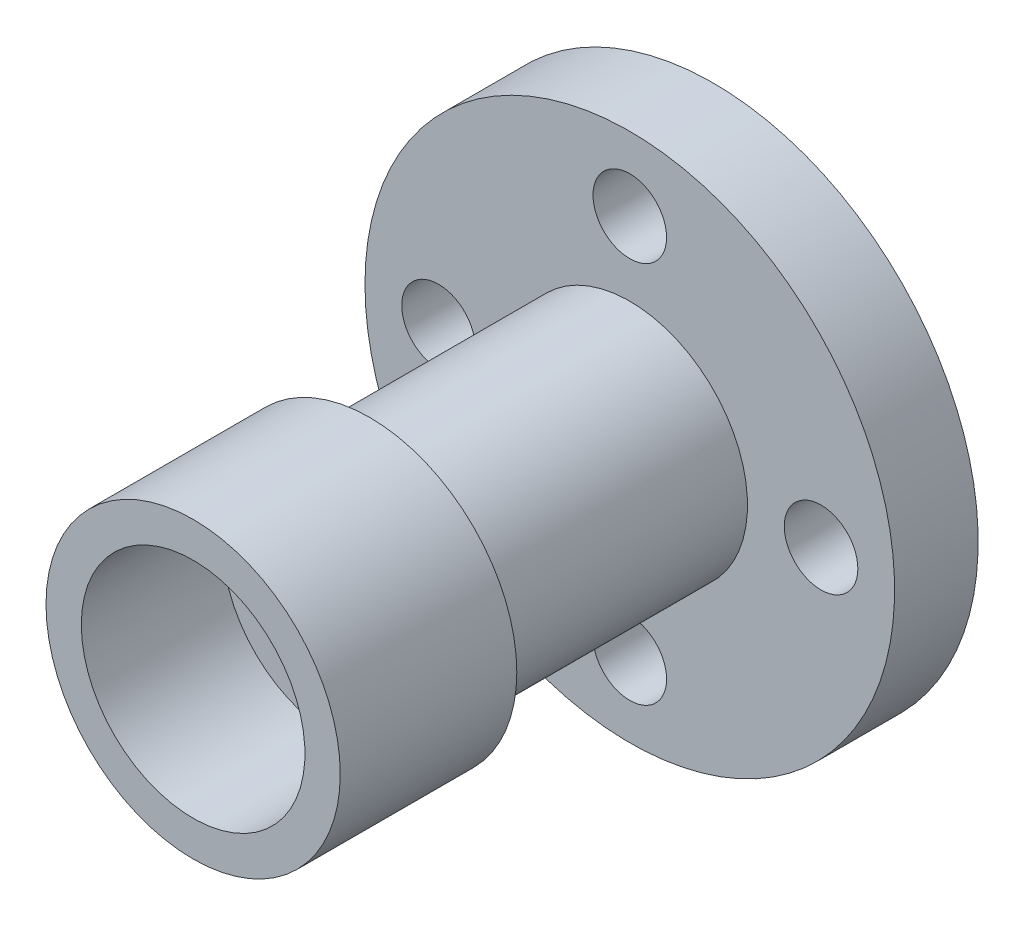
ISO-10303-21;
HEADER;
FILE_DESCRIPTION(('STEP AP214'),'2;1');
FILE_NAME('part.step','',(''),(''),'','','');
FILE_SCHEMA(('AUTOMOTIVE_DESIGN { 1 0 10303 214 1 1 1 1 }'));
ENDSEC;
DATA;
#1=APPLICATION_CONTEXT('core data for automotive mechanical design processes');
#2=APPLICATION_PROTOCOL_DEFINITION('international standard','automotive_design',2000,#1);
#3=PRODUCT_CONTEXT('',#1,'mechanical');
#4=PRODUCT('Part','Part','',(#3));
#5=PRODUCT_RELATED_PRODUCT_CATEGORY('part','',(#4));
#6=PRODUCT_DEFINITION_FORMATION('','',#4);
#7=PRODUCT_DEFINITION_CONTEXT('part definition',#1,'design');
#8=PRODUCT_DEFINITION('design','',#6,#7);
#9=PRODUCT_DEFINITION_SHAPE('','',#8);
#10=(LENGTH_UNIT() NAMED_UNIT(*) SI_UNIT(.MILLI.,.METRE.));
#11=(NAMED_UNIT(*) PLANE_ANGLE_UNIT() SI_UNIT($,.RADIAN.));
#12=(NAMED_UNIT(*) SI_UNIT($,.STERADIAN.) SOLID_ANGLE_UNIT());
#13=UNCERTAINTY_MEASURE_WITH_UNIT(LENGTH_MEASURE(1.E-05),#10,'distance_accuracy_value','');
#14=(GEOMETRIC_REPRESENTATION_CONTEXT(3) GLOBAL_UNCERTAINTY_ASSIGNED_CONTEXT((#13)) GLOBAL_UNIT_ASSIGNED_CONTEXT((#10,
#11,#12)) REPRESENTATION_CONTEXT('',''));
#15=CARTESIAN_POINT('',(0.,0.,0.));
#16=DIRECTION('',(0.,0.,1.));
#17=DIRECTION('',(1.,0.,0.));
#18=AXIS2_PLACEMENT_3D('',#15,#16,#17);
#19=CARTESIAN_POINT('',(0.,0.,0.));
#20=DIRECTION('',(0.,0.,-1.));
#21=DIRECTION('',(-1.,0.,0.));
#22=AXIS2_PLACEMENT_3D('',#19,#20,#21);
#23=CYLINDRICAL_SURFACE('',#22,45.);
#24=CARTESIAN_POINT('',(0.,0.,14.2));
#25=DIRECTION('',(0.,0.,-1.));
#26=DIRECTION('',(-1.,0.,0.));
#27=AXIS2_PLACEMENT_3D('',#24,#25,#26);
#28=CIRCLE('',#27,45.);
#29=CARTESIAN_POINT('',(-45.,0.,14.2));
#30=VERTEX_POINT('',#29);
#31=EDGE_CURVE('E10',#30,#30,#28,.T.);
#32=ORIENTED_EDGE('',*,*,#31,.T.);
#33=EDGE_LOOP('',(#32));
#34=FACE_BOUND('',#33,.T.);
#35=CARTESIAN_POINT('',(0.,0.,0.));
#36=DIRECTION('',(0.,0.,-1.));
#37=DIRECTION('',(-1.,0.,0.));
#38=AXIS2_PLACEMENT_3D('',#35,#36,#37);
#39=CIRCLE('',#38,45.);
#40=CARTESIAN_POINT('',(-45.,0.,0.));
#41=VERTEX_POINT('',#40);
#42=EDGE_CURVE('E74',#41,#41,#39,.T.);
#43=ORIENTED_EDGE('',*,*,#42,.F.);
#44=EDGE_LOOP('',(#43));
#45=FACE_BOUND('',#44,.T.);
#46=ADVANCED_FACE('F37',(#34,#45),#23,.T.);
#47=CARTESIAN_POINT('',(0.,45.,14.2));
#48=DIRECTION('',(0.,0.,1.));
#49=DIRECTION('',(1.,0.,0.));
#50=AXIS2_PLACEMENT_3D('',#47,#48,#49);
#51=PLANE('',#50);
#52=CARTESIAN_POINT('',(0.,32.5,14.2));
#53=DIRECTION('',(0.,0.,1.));
#54=DIRECTION('',(1.,0.,0.));
#55=AXIS2_PLACEMENT_3D('',#52,#53,#54);
#56=CIRCLE('',#55,6.25);
#57=CARTESIAN_POINT('',(6.25,32.5,14.2));
#58=VERTEX_POINT('',#57);
#59=EDGE_CURVE('E77',#58,#58,#56,.T.);
#60=ORIENTED_EDGE('',*,*,#59,.F.);
#61=EDGE_LOOP('',(#60));
#62=FACE_BOUND('',#61,.T.);
#63=CARTESIAN_POINT('',(32.5,3.40419430537206E-13,14.2));
#64=DIRECTION('',(0.,0.,1.));
#65=DIRECTION('',(1.,0.,0.));
#66=AXIS2_PLACEMENT_3D('',#63,#64,#65);
#67=CIRCLE('',#66,6.25);
#68=CARTESIAN_POINT('',(38.75,3.40419430537206E-13,14.2));
#69=VERTEX_POINT('',#68);
#70=EDGE_CURVE('E80',#69,#69,#67,.T.);
#71=ORIENTED_EDGE('',*,*,#70,.F.);
#72=EDGE_LOOP('',(#71));
#73=FACE_BOUND('',#72,.T.);
#74=CARTESIAN_POINT('',(-32.5,-1.13473143512402E-13,14.2));
#75=DIRECTION('',(0.,0.,1.));
#76=DIRECTION('',(1.,0.,0.));
#77=AXIS2_PLACEMENT_3D('',#74,#75,#76);
#78=CIRCLE('',#77,6.25);
#79=CARTESIAN_POINT('',(-26.25,-1.13473143512402E-13,14.2));
#80=VERTEX_POINT('',#79);
#81=EDGE_CURVE('E83',#80,#80,#78,.T.);
#82=ORIENTED_EDGE('',*,*,#81,.F.);
#83=EDGE_LOOP('',(#82));
#84=FACE_BOUND('',#83,.T.);
#85=CARTESIAN_POINT('',(2.26946287024804E-13,-32.5,14.2));
#86=DIRECTION('',(0.,0.,1.));
#87=DIRECTION('',(1.,0.,0.));
#88=AXIS2_PLACEMENT_3D('',#85,#86,#87);
#89=CIRCLE('',#88,6.25);
#90=CARTESIAN_POINT('',(6.25000000000023,-32.5,14.2));
#91=VERTEX_POINT('',#90);
#92=EDGE_CURVE('E86',#91,#91,#89,.T.);
#93=ORIENTED_EDGE('',*,*,#92,.F.);
#94=EDGE_LOOP('',(#93));
#95=FACE_BOUND('',#94,.T.);
#96=CARTESIAN_POINT('',(0.,0.,14.2));
#97=DIRECTION('',(0.,0.,-1.));
#98=DIRECTION('',(-1.,0.,0.));
#99=AXIS2_PLACEMENT_3D('',#96,#97,#98);
#100=CIRCLE('',#99,20.);
#101=CARTESIAN_POINT('',(-20.,0.,14.2));
#102=VERTEX_POINT('',#101);
#103=EDGE_CURVE('E43',#102,#102,#100,.T.);
#104=ORIENTED_EDGE('',*,*,#103,.T.);
#105=EDGE_LOOP('',(#104));
#106=FACE_BOUND('',#105,.T.);
#107=ORIENTED_EDGE('',*,*,#31,.F.);
#108=EDGE_LOOP('',(#107));
#109=FACE_BOUND('',#108,.T.);
#110=ADVANCED_FACE('F164',(#62,#73,#84,#95,#106,#109),#51,.T.);
#111=CARTESIAN_POINT('',(0.,0.,0.));
#112=DIRECTION('',(0.,0.,-1.));
#113=DIRECTION('',(-1.,0.,0.));
#114=AXIS2_PLACEMENT_3D('',#111,#112,#113);
#115=CYLINDRICAL_SURFACE('',#114,20.);
#116=CARTESIAN_POINT('',(0.,0.,58.4));
#117=DIRECTION('',(0.,0.,-1.));
#118=DIRECTION('',(-1.,0.,0.));
#119=AXIS2_PLACEMENT_3D('',#116,#117,#118);
#120=CIRCLE('',#119,20.);
#121=CARTESIAN_POINT('',(-20.,0.,58.4));
#122=VERTEX_POINT('',#121);
#123=EDGE_CURVE('E47',#122,#122,#120,.T.);
#124=ORIENTED_EDGE('',*,*,#123,.T.);
#125=EDGE_LOOP('',(#124));
#126=FACE_BOUND('',#125,.T.);
#127=ORIENTED_EDGE('',*,*,#103,.F.);
#128=EDGE_LOOP('',(#127));
#129=FACE_BOUND('',#128,.T.);
#130=ADVANCED_FACE('F158',(#126,#129),#115,.T.);
#131=CARTESIAN_POINT('',(0.,25.,58.4));
#132=DIRECTION('',(0.,0.,-1.));
#133=DIRECTION('',(-1.,0.,0.));
#134=AXIS2_PLACEMENT_3D('',#131,#132,#133);
#135=PLANE('',#134);
#136=CARTESIAN_POINT('',(0.,0.,58.4));
#137=DIRECTION('',(0.,0.,-1.));
#138=DIRECTION('',(-1.,0.,0.));
#139=AXIS2_PLACEMENT_3D('',#136,#137,#138);
#140=CIRCLE('',#139,25.);
#141=CARTESIAN_POINT('',(-25.,0.,58.4));
#142=VERTEX_POINT('',#141);
#143=EDGE_CURVE('E51',#142,#142,#140,.T.);
#144=ORIENTED_EDGE('',*,*,#143,.T.);
#145=EDGE_LOOP('',(#144));
#146=FACE_BOUND('',#145,.T.);
#147=ORIENTED_EDGE('',*,*,#123,.F.);
#148=EDGE_LOOP('',(#147));
#149=FACE_BOUND('',#148,.T.);
#150=ADVANCED_FACE('F152',(#146,#149),#135,.T.);
#151=CARTESIAN_POINT('',(0.,0.,0.));
#152=DIRECTION('',(0.,0.,-1.));
#153=DIRECTION('',(-1.,0.,0.));
#154=AXIS2_PLACEMENT_3D('',#151,#152,#153);
#155=CYLINDRICAL_SURFACE('',#154,25.);
#156=CARTESIAN_POINT('',(0.,0.,88.4));
#157=DIRECTION('',(0.,0.,-1.));
#158=DIRECTION('',(-1.,0.,0.));
#159=AXIS2_PLACEMENT_3D('',#156,#157,#158);
#160=CIRCLE('',#159,25.);
#161=CARTESIAN_POINT('',(-25.,0.,88.4));
#162=VERTEX_POINT('',#161);
#163=EDGE_CURVE('E56',#162,#162,#160,.T.);
#164=ORIENTED_EDGE('',*,*,#163,.T.);
#165=EDGE_LOOP('',(#164));
#166=FACE_BOUND('',#165,.T.);
#167=ORIENTED_EDGE('',*,*,#143,.F.);
#168=EDGE_LOOP('',(#167));
#169=FACE_BOUND('',#168,.T.);
#170=ADVANCED_FACE('F146',(#166,#169),#155,.T.);
#171=CARTESIAN_POINT('',(0.,25.,88.4));
#172=DIRECTION('',(0.,0.,1.));
#173=DIRECTION('',(1.,0.,0.));
#174=AXIS2_PLACEMENT_3D('',#171,#172,#173);
#175=PLANE('',#174);
#176=CARTESIAN_POINT('',(0.,0.,88.4));
#177=DIRECTION('',(0.,0.,-1.));
#178=DIRECTION('',(-1.,0.,0.));
#179=AXIS2_PLACEMENT_3D('',#176,#177,#178);
#180=CIRCLE('',#179,19.);
#181=CARTESIAN_POINT('',(-19.,0.,88.4));
#182=VERTEX_POINT('',#181);
#183=EDGE_CURVE('E59',#182,#182,#180,.T.);
#184=ORIENTED_EDGE('',*,*,#183,.T.);
#185=EDGE_LOOP('',(#184));
#186=FACE_BOUND('',#185,.T.);
#187=ORIENTED_EDGE('',*,*,#163,.F.);
#188=EDGE_LOOP('',(#187));
#189=FACE_BOUND('',#188,.T.);
#190=ADVANCED_FACE('F140',(#186,#189),#175,.T.);
#191=CARTESIAN_POINT('',(0.,0.,0.));
#192=DIRECTION('',(0.,0.,-1.));
#193=DIRECTION('',(-1.,0.,0.));
#194=AXIS2_PLACEMENT_3D('',#191,#192,#193);
#195=CYLINDRICAL_SURFACE('',#194,19.);
#196=CARTESIAN_POINT('',(0.,0.,64.4));
#197=DIRECTION('',(0.,0.,-1.));
#198=DIRECTION('',(-1.,0.,0.));
#199=AXIS2_PLACEMENT_3D('',#196,#197,#198);
#200=CIRCLE('',#199,19.);
#201=CARTESIAN_POINT('',(-19.,0.,64.4));
#202=VERTEX_POINT('',#201);
#203=EDGE_CURVE('E62',#202,#202,#200,.T.);
#204=ORIENTED_EDGE('',*,*,#203,.T.);
#205=EDGE_LOOP('',(#204));
#206=FACE_BOUND('',#205,.T.);
#207=ORIENTED_EDGE('',*,*,#183,.F.);
#208=EDGE_LOOP('',(#207));
#209=FACE_BOUND('',#208,.T.);
#210=ADVANCED_FACE('F134',(#206,#209),#195,.F.);
#211=CARTESIAN_POINT('',(0.,19.,64.4));
#212=DIRECTION('',(0.,0.,1.));
#213=DIRECTION('',(1.,0.,0.));
#214=AXIS2_PLACEMENT_3D('',#211,#212,#213);
#215=PLANE('',#214);
#216=CARTESIAN_POINT('',(0.,0.,64.4));
#217=DIRECTION('',(0.,0.,-1.));
#218=DIRECTION('',(-1.,0.,0.));
#219=AXIS2_PLACEMENT_3D('',#216,#217,#218);
#220=CIRCLE('',#219,15.);
#221=CARTESIAN_POINT('',(-15.,0.,64.4));
#222=VERTEX_POINT('',#221);
#223=EDGE_CURVE('E65',#222,#222,#220,.T.);
#224=ORIENTED_EDGE('',*,*,#223,.T.);
#225=EDGE_LOOP('',(#224));
#226=FACE_BOUND('',#225,.T.);
#227=ORIENTED_EDGE('',*,*,#203,.F.);
#228=EDGE_LOOP('',(#227));
#229=FACE_BOUND('',#228,.T.);
#230=ADVANCED_FACE('F128',(#226,#229),#215,.T.);
#231=CARTESIAN_POINT('',(0.,0.,0.));
#232=DIRECTION('',(0.,0.,-1.));
#233=DIRECTION('',(-1.,0.,0.));
#234=AXIS2_PLACEMENT_3D('',#231,#232,#233);
#235=CYLINDRICAL_SURFACE('',#234,15.);
#236=CARTESIAN_POINT('',(0.,0.,3.));
#237=DIRECTION('',(0.,0.,-1.));
#238=DIRECTION('',(-1.,0.,0.));
#239=AXIS2_PLACEMENT_3D('',#236,#237,#238);
#240=CIRCLE('',#239,15.);
#241=CARTESIAN_POINT('',(-15.,0.,3.));
#242=VERTEX_POINT('',#241);
#243=EDGE_CURVE('E68',#242,#242,#240,.T.);
#244=ORIENTED_EDGE('',*,*,#243,.T.);
#245=EDGE_LOOP('',(#244));
#246=FACE_BOUND('',#245,.T.);
#247=ORIENTED_EDGE('',*,*,#223,.F.);
#248=EDGE_LOOP('',(#247));
#249=FACE_BOUND('',#248,.T.);
#250=ADVANCED_FACE('F122',(#246,#249),#235,.F.);
#251=CARTESIAN_POINT('',(0.,0.,3.));
#252=DIRECTION('',(0.,0.,-1.));
#253=DIRECTION('',(-1.,0.,0.));
#254=AXIS2_PLACEMENT_3D('',#251,#252,#253);
#255=CONICAL_SURFACE('',#254,15.,0.862170054667226);
#256=CARTESIAN_POINT('',(0.,0.,0.));
#257=DIRECTION('',(0.,0.,-1.));
#258=DIRECTION('',(-1.,0.,0.));
#259=AXIS2_PLACEMENT_3D('',#256,#257,#258);
#260=CIRCLE('',#259,18.5);
#261=CARTESIAN_POINT('',(-18.5,0.,0.));
#262=VERTEX_POINT('',#261);
#263=EDGE_CURVE('E71',#262,#262,#260,.T.);
#264=ORIENTED_EDGE('',*,*,#263,.T.);
#265=EDGE_LOOP('',(#264));
#266=FACE_BOUND('',#265,.T.);
#267=ORIENTED_EDGE('',*,*,#243,.F.);
#268=EDGE_LOOP('',(#267));
#269=FACE_BOUND('',#268,.T.);
#270=ADVANCED_FACE('F108',(#266,#269),#255,.F.);
#271=CARTESIAN_POINT('',(0.,18.5,0.));
#272=DIRECTION('',(0.,0.,-1.));
#273=DIRECTION('',(-1.,0.,0.));
#274=AXIS2_PLACEMENT_3D('',#271,#272,#273);
#275=PLANE('',#274);
#276=CARTESIAN_POINT('',(0.,32.5,0.));
#277=DIRECTION('',(0.,0.,-1.));
#278=DIRECTION('',(-1.,0.,0.));
#279=AXIS2_PLACEMENT_3D('',#276,#277,#278);
#280=CIRCLE('',#279,6.25);
#281=CARTESIAN_POINT('',(-6.25,32.5,0.));
#282=VERTEX_POINT('',#281);
#283=EDGE_CURVE('E89',#282,#282,#280,.T.);
#284=ORIENTED_EDGE('',*,*,#283,.F.);
#285=EDGE_LOOP('',(#284));
#286=FACE_BOUND('',#285,.T.);
#287=CARTESIAN_POINT('',(32.5,3.40419430537206E-13,0.));
#288=DIRECTION('',(0.,0.,-1.));
#289=DIRECTION('',(-1.,0.,0.));
#290=AXIS2_PLACEMENT_3D('',#287,#288,#289);
#291=CIRCLE('',#290,6.25);
#292=CARTESIAN_POINT('',(26.25,3.40419430537206E-13,0.));
#293=VERTEX_POINT('',#292);
#294=EDGE_CURVE('E96',#293,#293,#291,.T.);
#295=ORIENTED_EDGE('',*,*,#294,.F.);
#296=EDGE_LOOP('',(#295));
#297=FACE_BOUND('',#296,.T.);
#298=CARTESIAN_POINT('',(-32.5,-1.13473143512402E-13,0.));
#299=DIRECTION('',(0.,0.,-1.));
#300=DIRECTION('',(-1.,0.,0.));
#301=AXIS2_PLACEMENT_3D('',#298,#299,#300);
#302=CIRCLE('',#301,6.25);
#303=CARTESIAN_POINT('',(-38.75,-1.13473143512402E-13,0.));
#304=VERTEX_POINT('',#303);
#305=EDGE_CURVE('E93',#304,#304,#302,.T.);
#306=ORIENTED_EDGE('',*,*,#305,.F.);
#307=EDGE_LOOP('',(#306));
#308=FACE_BOUND('',#307,.T.);
#309=CARTESIAN_POINT('',(2.26946287024804E-13,-32.5,0.));
#310=DIRECTION('',(0.,0.,-1.));
#311=DIRECTION('',(-1.,0.,0.));
#312=AXIS2_PLACEMENT_3D('',#309,#310,#311);
#313=CIRCLE('',#312,6.25);
#314=CARTESIAN_POINT('',(-6.24999999999977,-32.5,0.));
#315=VERTEX_POINT('',#314);
#316=EDGE_CURVE('E90',#315,#315,#313,.T.);
#317=ORIENTED_EDGE('',*,*,#316,.F.);
#318=EDGE_LOOP('',(#317));
#319=FACE_BOUND('',#318,.T.);
#320=ORIENTED_EDGE('',*,*,#42,.T.);
#321=EDGE_LOOP('',(#320));
#322=FACE_BOUND('',#321,.T.);
#323=ORIENTED_EDGE('',*,*,#263,.F.);
#324=EDGE_LOOP('',(#323));
#325=FACE_BOUND('',#324,.T.);
#326=ADVANCED_FACE('F104',(#286,#297,#308,#319,#322,#325),#275,.T.);
#327=CARTESIAN_POINT('',(2.26946287024804E-13,-32.5,88.4));
#328=DIRECTION('',(0.,0.,-1.));
#329=DIRECTION('',(-1.,0.,0.));
#330=AXIS2_PLACEMENT_3D('',#327,#328,#329);
#331=CYLINDRICAL_SURFACE('',#330,6.25);
#332=ORIENTED_EDGE('',*,*,#92,.T.);
#333=EDGE_LOOP('',(#332));
#334=FACE_BOUND('',#333,.T.);
#335=ORIENTED_EDGE('',*,*,#316,.T.);
#336=EDGE_LOOP('',(#335));
#337=FACE_BOUND('',#336,.T.);
#338=ADVANCED_FACE('F107',(#334,#337),#331,.F.);
#339=CARTESIAN_POINT('',(-32.5,-1.13473143512402E-13,88.4));
#340=DIRECTION('',(0.,0.,-1.));
#341=DIRECTION('',(-1.,0.,0.));
#342=AXIS2_PLACEMENT_3D('',#339,#340,#341);
#343=CYLINDRICAL_SURFACE('',#342,6.25);
#344=ORIENTED_EDGE('',*,*,#81,.T.);
#345=EDGE_LOOP('',(#344));
#346=FACE_BOUND('',#345,.T.);
#347=ORIENTED_EDGE('',*,*,#305,.T.);
#348=EDGE_LOOP('',(#347));
#349=FACE_BOUND('',#348,.T.);
#350=ADVANCED_FACE('F242',(#346,#349),#343,.F.);
#351=CARTESIAN_POINT('',(32.5,3.40419430537206E-13,88.4));
#352=DIRECTION('',(0.,0.,-1.));
#353=DIRECTION('',(-1.,0.,0.));
#354=AXIS2_PLACEMENT_3D('',#351,#352,#353);
#355=CYLINDRICAL_SURFACE('',#354,6.25);
#356=ORIENTED_EDGE('',*,*,#70,.T.);
#357=EDGE_LOOP('',(#356));
#358=FACE_BOUND('',#357,.T.);
#359=ORIENTED_EDGE('',*,*,#294,.T.);
#360=EDGE_LOOP('',(#359));
#361=FACE_BOUND('',#360,.T.);
#362=ADVANCED_FACE('F252',(#358,#361),#355,.F.);
#363=CARTESIAN_POINT('',(0.,32.5,88.4));
#364=DIRECTION('',(0.,0.,-1.));
#365=DIRECTION('',(-1.,0.,0.));
#366=AXIS2_PLACEMENT_3D('',#363,#364,#365);
#367=CYLINDRICAL_SURFACE('',#366,6.25);
#368=ORIENTED_EDGE('',*,*,#59,.T.);
#369=EDGE_LOOP('',(#368));
#370=FACE_BOUND('',#369,.T.);
#371=ORIENTED_EDGE('',*,*,#283,.T.);
#372=EDGE_LOOP('',(#371));
#373=FACE_BOUND('',#372,.T.);
#374=ADVANCED_FACE('F102',(#370,#373),#367,.F.);
#375=CLOSED_SHELL('',(#46,#110,#130,#150,#170,#190,#210,#230,#250,#270,#326,#338,#350,#362,#374));
#376=MANIFOLD_SOLID_BREP('B2',#375);
#377=ADVANCED_BREP_SHAPE_REPRESENTATION('',(#18,#376),#14);
#378=SHAPE_DEFINITION_REPRESENTATION(#9,#377);
ENDSEC;
END-ISO-10303-21;
